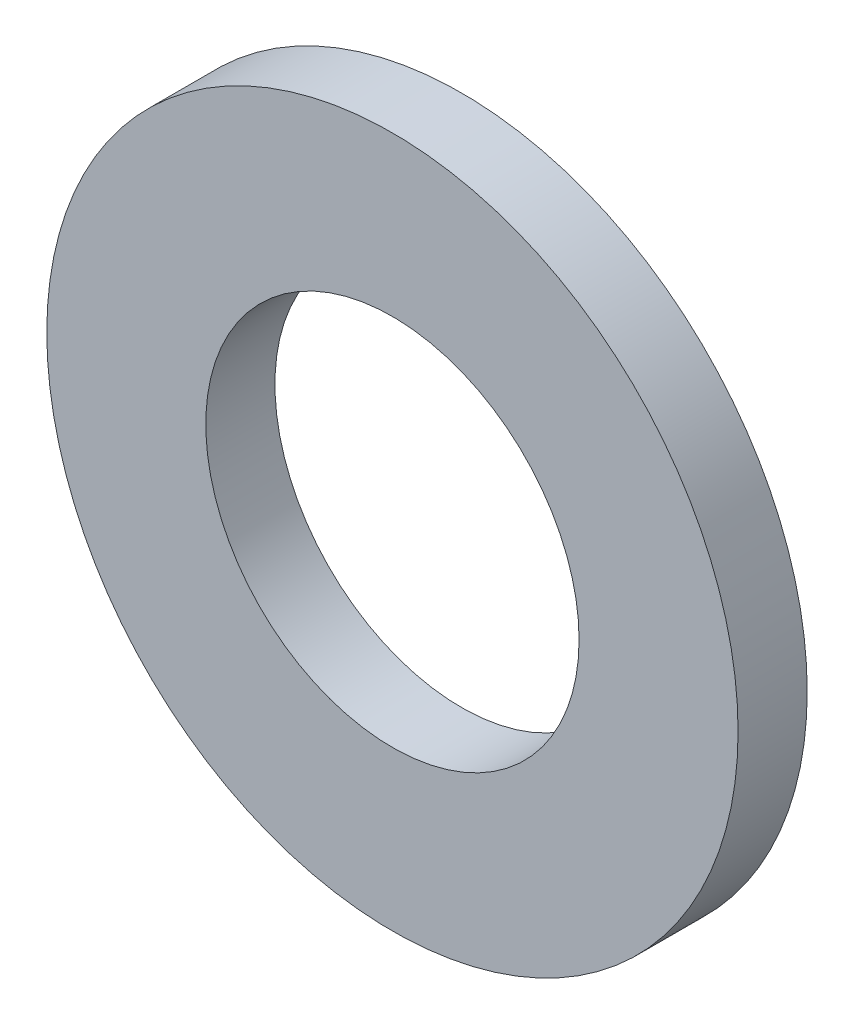
ISO-10303-21;
HEADER;
FILE_DESCRIPTION(('STEP AP214'),'2;1');
FILE_NAME('part.step','',(''),(''),'','','');
FILE_SCHEMA(('AUTOMOTIVE_DESIGN { 1 0 10303 214 1 1 1 1 }'));
ENDSEC;
DATA;
#1=APPLICATION_CONTEXT('core data for automotive mechanical design processes');
#2=APPLICATION_PROTOCOL_DEFINITION('international standard','automotive_design',2000,#1);
#3=PRODUCT_CONTEXT('',#1,'mechanical');
#4=PRODUCT('Part','Part','',(#3));
#5=PRODUCT_RELATED_PRODUCT_CATEGORY('part','',(#4));
#6=PRODUCT_DEFINITION_FORMATION('','',#4);
#7=PRODUCT_DEFINITION_CONTEXT('part definition',#1,'design');
#8=PRODUCT_DEFINITION('design','',#6,#7);
#9=PRODUCT_DEFINITION_SHAPE('','',#8);
#10=(LENGTH_UNIT() NAMED_UNIT(*) SI_UNIT(.MILLI.,.METRE.));
#11=(NAMED_UNIT(*) PLANE_ANGLE_UNIT() SI_UNIT($,.RADIAN.));
#12=(NAMED_UNIT(*) SI_UNIT($,.STERADIAN.) SOLID_ANGLE_UNIT());
#13=UNCERTAINTY_MEASURE_WITH_UNIT(LENGTH_MEASURE(1.E-05),#10,'distance_accuracy_value','');
#14=(GEOMETRIC_REPRESENTATION_CONTEXT(3) GLOBAL_UNCERTAINTY_ASSIGNED_CONTEXT((#13)) GLOBAL_UNIT_ASSIGNED_CONTEXT((#10,
#11,#12)) REPRESENTATION_CONTEXT('',''));
#15=CARTESIAN_POINT('',(0.,0.,0.));
#16=DIRECTION('',(0.,0.,1.));
#17=DIRECTION('',(1.,0.,0.));
#18=AXIS2_PLACEMENT_3D('',#15,#16,#17);
#19=CARTESIAN_POINT('',(0.,0.,0.5));
#20=DIRECTION('',(0.,0.,1.));
#21=DIRECTION('',(1.,0.,0.));
#22=AXIS2_PLACEMENT_3D('',#19,#20,#21);
#23=PLANE('',#22);
#24=CARTESIAN_POINT('',(0.,0.,0.5));
#25=DIRECTION('',(0.,0.,1.));
#26=DIRECTION('',(1.,0.,0.));
#27=AXIS2_PLACEMENT_3D('',#24,#25,#26);
#28=CIRCLE('',#27,2.5);
#29=CARTESIAN_POINT('',(2.5,0.,0.5));
#30=VERTEX_POINT('',#29);
#31=EDGE_CURVE('E10',#30,#30,#28,.T.);
#32=ORIENTED_EDGE('',*,*,#31,.T.);
#33=EDGE_LOOP('',(#32));
#34=FACE_BOUND('',#33,.T.);
#35=CARTESIAN_POINT('',(0.,0.,0.5));
#36=DIRECTION('',(0.,0.,1.));
#37=DIRECTION('',(1.,0.,0.));
#38=AXIS2_PLACEMENT_3D('',#35,#36,#37);
#39=CIRCLE('',#38,1.35);
#40=CARTESIAN_POINT('',(1.35,0.,0.5));
#41=VERTEX_POINT('',#40);
#42=EDGE_CURVE('E55',#41,#41,#39,.T.);
#43=ORIENTED_EDGE('',*,*,#42,.F.);
#44=EDGE_LOOP('',(#43));
#45=FACE_BOUND('',#44,.T.);
#46=ADVANCED_FACE('F41',(#34,#45),#23,.T.);
#47=CARTESIAN_POINT('',(0.,0.,0.));
#48=DIRECTION('',(0.,0.,1.));
#49=DIRECTION('',(1.,0.,0.));
#50=AXIS2_PLACEMENT_3D('',#47,#48,#49);
#51=PLANE('',#50);
#52=CARTESIAN_POINT('',(0.,0.,0.));
#53=DIRECTION('',(0.,0.,1.));
#54=DIRECTION('',(1.,0.,0.));
#55=AXIS2_PLACEMENT_3D('',#52,#53,#54);
#56=CIRCLE('',#55,2.5);
#57=CARTESIAN_POINT('',(2.5,0.,0.));
#58=VERTEX_POINT('',#57);
#59=EDGE_CURVE('E44',#58,#58,#56,.T.);
#60=ORIENTED_EDGE('',*,*,#59,.F.);
#61=EDGE_LOOP('',(#60));
#62=FACE_BOUND('',#61,.T.);
#63=CARTESIAN_POINT('',(0.,0.,0.));
#64=DIRECTION('',(0.,0.,1.));
#65=DIRECTION('',(1.,0.,0.));
#66=AXIS2_PLACEMENT_3D('',#63,#64,#65);
#67=CIRCLE('',#66,1.35);
#68=CARTESIAN_POINT('',(1.35,0.,0.));
#69=VERTEX_POINT('',#68);
#70=EDGE_CURVE('E53',#69,#69,#67,.T.);
#71=ORIENTED_EDGE('',*,*,#70,.T.);
#72=EDGE_LOOP('',(#71));
#73=FACE_BOUND('',#72,.T.);
#74=ADVANCED_FACE('F63',(#62,#73),#51,.F.);
#75=CARTESIAN_POINT('',(0.,0.,0.5));
#76=DIRECTION('',(0.,0.,-1.));
#77=DIRECTION('',(-1.,0.,0.));
#78=AXIS2_PLACEMENT_3D('',#75,#76,#77);
#79=CYLINDRICAL_SURFACE('',#78,2.5);
#80=ORIENTED_EDGE('',*,*,#31,.F.);
#81=EDGE_LOOP('',(#80));
#82=FACE_BOUND('',#81,.T.);
#83=ORIENTED_EDGE('',*,*,#59,.T.);
#84=EDGE_LOOP('',(#83));
#85=FACE_BOUND('',#84,.T.);
#86=ADVANCED_FACE('F43',(#82,#85),#79,.T.);
#87=CARTESIAN_POINT('',(0.,0.,0.5));
#88=DIRECTION('',(0.,0.,-1.));
#89=DIRECTION('',(-1.,0.,0.));
#90=AXIS2_PLACEMENT_3D('',#87,#88,#89);
#91=CYLINDRICAL_SURFACE('',#90,1.35);
#92=ORIENTED_EDGE('',*,*,#42,.T.);
#93=EDGE_LOOP('',(#92));
#94=FACE_BOUND('',#93,.T.);
#95=ORIENTED_EDGE('',*,*,#70,.F.);
#96=EDGE_LOOP('',(#95));
#97=FACE_BOUND('',#96,.T.);
#98=ADVANCED_FACE('F58',(#94,#97),#91,.F.);
#99=CLOSED_SHELL('',(#46,#74,#86,#98));
#100=MANIFOLD_SOLID_BREP('B2',#99);
#101=ADVANCED_BREP_SHAPE_REPRESENTATION('',(#18,#100),#14);
#102=SHAPE_DEFINITION_REPRESENTATION(#9,#101);
ENDSEC;
END-ISO-10303-21;
